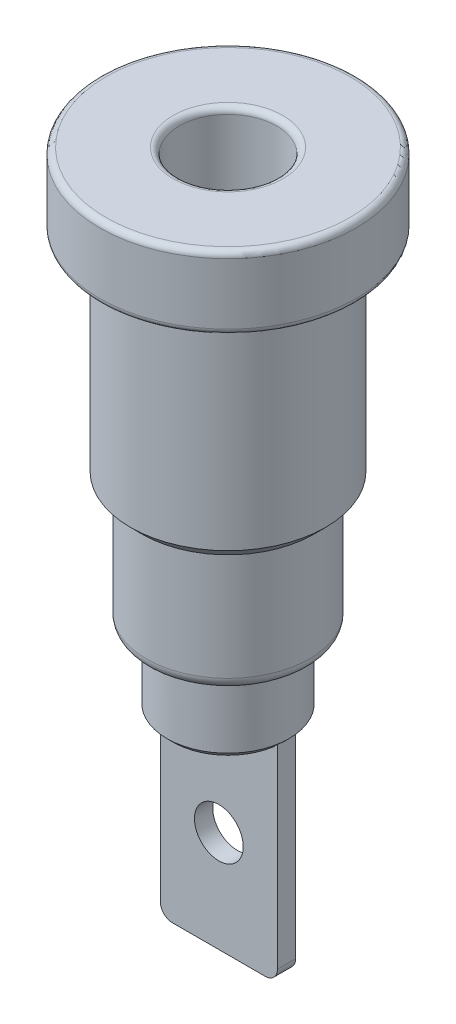
ISO-10303-21;
HEADER;
FILE_DESCRIPTION(('STEP AP214'),'2;1');
FILE_NAME('part.step','',(''),(''),'','','');
FILE_SCHEMA(('AUTOMOTIVE_DESIGN { 1 0 10303 214 1 1 1 1 }'));
ENDSEC;
DATA;
#1=APPLICATION_CONTEXT('core data for automotive mechanical design processes');
#2=APPLICATION_PROTOCOL_DEFINITION('international standard','automotive_design',2000,#1);
#3=PRODUCT_CONTEXT('',#1,'mechanical');
#4=PRODUCT('Part','Part','',(#3));
#5=PRODUCT_RELATED_PRODUCT_CATEGORY('part','',(#4));
#6=PRODUCT_DEFINITION_FORMATION('','',#4);
#7=PRODUCT_DEFINITION_CONTEXT('part definition',#1,'design');
#8=PRODUCT_DEFINITION('design','',#6,#7);
#9=PRODUCT_DEFINITION_SHAPE('','',#8);
#10=(LENGTH_UNIT() NAMED_UNIT(*) SI_UNIT(.MILLI.,.METRE.));
#11=(NAMED_UNIT(*) PLANE_ANGLE_UNIT() SI_UNIT($,.RADIAN.));
#12=(NAMED_UNIT(*) SI_UNIT($,.STERADIAN.) SOLID_ANGLE_UNIT());
#13=UNCERTAINTY_MEASURE_WITH_UNIT(LENGTH_MEASURE(1.E-05),#10,'distance_accuracy_value','');
#14=(GEOMETRIC_REPRESENTATION_CONTEXT(3) GLOBAL_UNCERTAINTY_ASSIGNED_CONTEXT((#13)) GLOBAL_UNIT_ASSIGNED_CONTEXT((#10,
#11,#12)) REPRESENTATION_CONTEXT('',''));
#15=CARTESIAN_POINT('',(0.,0.,0.));
#16=DIRECTION('',(0.,0.,1.));
#17=DIRECTION('',(1.,0.,0.));
#18=AXIS2_PLACEMENT_3D('',#15,#16,#17);
#19=CARTESIAN_POINT('',(-2.5,-20.,0.));
#20=DIRECTION('',(0.,-1.,0.));
#21=DIRECTION('',(1.,0.,0.));
#22=AXIS2_PLACEMENT_3D('',#19,#20,#21);
#23=PLANE('',#22);
#24=DIRECTION('',(-1.,0.,0.));
#25=VECTOR('',#24,1.);
#26=CARTESIAN_POINT('',(2.4,-20.,0.375));
#27=LINE('',#26,#25);
#28=CARTESIAN_POINT('',(2.21852991866235,-20.,0.375));
#29=VERTEX_POINT('',#28);
#30=CARTESIAN_POINT('',(-2.21852991866235,-20.,0.375));
#31=VERTEX_POINT('',#30);
#32=EDGE_CURVE('E123',#29,#31,#27,.T.);
#33=ORIENTED_EDGE('',*,*,#32,.F.);
#34=CARTESIAN_POINT('',(0.,-20.,0.));
#35=DIRECTION('',(0.,-1.,0.));
#36=DIRECTION('',(1.,0.,0.));
#37=AXIS2_PLACEMENT_3D('',#34,#35,#36);
#38=CIRCLE('',#37,2.25);
#39=EDGE_CURVE('E182',#29,#31,#38,.T.);
#40=ORIENTED_EDGE('',*,*,#39,.T.);
#41=EDGE_LOOP('',(#33,#40));
#42=FACE_BOUND('',#41,.T.);
#43=ADVANCED_FACE('F47',(#42),#23,.T.);
#44=DIRECTION('',(-1.,0.,0.));
#45=VECTOR('',#44,1.);
#46=CARTESIAN_POINT('',(2.4,-20.,-0.375));
#47=LINE('',#46,#45);
#48=CARTESIAN_POINT('',(2.21852991866235,-20.,-0.375));
#49=VERTEX_POINT('',#48);
#50=CARTESIAN_POINT('',(-2.21852991866235,-20.,-0.375));
#51=VERTEX_POINT('',#50);
#52=EDGE_CURVE('E146',#49,#51,#47,.T.);
#53=ORIENTED_EDGE('',*,*,#52,.T.);
#54=CARTESIAN_POINT('',(0.,-20.,0.));
#55=DIRECTION('',(0.,-1.,0.));
#56=DIRECTION('',(1.,0.,0.));
#57=AXIS2_PLACEMENT_3D('',#54,#55,#56);
#58=CIRCLE('',#57,2.25);
#59=EDGE_CURVE('E180',#51,#49,#58,.T.);
#60=ORIENTED_EDGE('',*,*,#59,.T.);
#61=EDGE_LOOP('',(#53,#60));
#62=FACE_BOUND('',#61,.T.);
#63=ADVANCED_FACE('F274',(#62),#23,.T.);
#64=CARTESIAN_POINT('',(0.,-20.,0.));
#65=DIRECTION('',(0.,1.,0.));
#66=DIRECTION('',(-1.,0.,0.));
#67=AXIS2_PLACEMENT_3D('',#64,#65,#66);
#68=CYLINDRICAL_SURFACE('',#67,2.);
#69=CARTESIAN_POINT('',(0.,-7.75,0.));
#70=DIRECTION('',(0.,1.,0.));
#71=DIRECTION('',(-1.,0.,0.));
#72=AXIS2_PLACEMENT_3D('',#69,#70,#71);
#73=CIRCLE('',#72,2.);
#74=CARTESIAN_POINT('',(-2.,-7.75,0.));
#75=VERTEX_POINT('',#74);
#76=EDGE_CURVE('E240',#75,#75,#73,.F.);
#77=ORIENTED_EDGE('',*,*,#76,.T.);
#78=EDGE_LOOP('',(#77));
#79=FACE_BOUND('',#78,.T.);
#80=CARTESIAN_POINT('',(0.,-0.25,0.));
#81=DIRECTION('',(0.,1.,0.));
#82=DIRECTION('',(-1.,0.,0.));
#83=AXIS2_PLACEMENT_3D('',#80,#81,#82);
#84=CIRCLE('',#83,2.);
#85=CARTESIAN_POINT('',(-2.,-0.25,0.));
#86=VERTEX_POINT('',#85);
#87=EDGE_CURVE('E237',#86,#86,#84,.T.);
#88=ORIENTED_EDGE('',*,*,#87,.T.);
#89=EDGE_LOOP('',(#88));
#90=FACE_BOUND('',#89,.T.);
#91=ADVANCED_FACE('F265',(#79,#90),#68,.F.);
#92=CARTESIAN_POINT('',(-2.,0.,0.));
#93=DIRECTION('',(0.,1.,0.));
#94=DIRECTION('',(-1.,0.,0.));
#95=AXIS2_PLACEMENT_3D('',#92,#93,#94);
#96=PLANE('',#95);
#97=CARTESIAN_POINT('',(0.,0.,0.));
#98=DIRECTION('',(0.,1.,0.));
#99=DIRECTION('',(-1.,0.,0.));
#100=AXIS2_PLACEMENT_3D('',#97,#98,#99);
#101=CIRCLE('',#100,2.25);
#102=CARTESIAN_POINT('',(-2.25,0.,0.));
#103=VERTEX_POINT('',#102);
#104=EDGE_CURVE('E246',#103,#103,#101,.F.);
#105=ORIENTED_EDGE('',*,*,#104,.T.);
#106=EDGE_LOOP('',(#105));
#107=FACE_BOUND('',#106,.T.);
#108=CARTESIAN_POINT('',(0.,0.,0.));
#109=DIRECTION('',(0.,1.,0.));
#110=DIRECTION('',(-1.,0.,0.));
#111=AXIS2_PLACEMENT_3D('',#108,#109,#110);
#112=CIRCLE('',#111,5.);
#113=CARTESIAN_POINT('',(-5.,0.,0.));
#114=VERTEX_POINT('',#113);
#115=EDGE_CURVE('E243',#114,#114,#112,.T.);
#116=ORIENTED_EDGE('',*,*,#115,.T.);
#117=EDGE_LOOP('',(#116));
#118=FACE_BOUND('',#117,.T.);
#119=ADVANCED_FACE('F263',(#107,#118),#96,.T.);
#120=CARTESIAN_POINT('',(0.,-20.,0.));
#121=DIRECTION('',(0.,1.,0.));
#122=DIRECTION('',(-1.,0.,0.));
#123=AXIS2_PLACEMENT_3D('',#120,#121,#122);
#124=CYLINDRICAL_SURFACE('',#123,5.25);
#125=CARTESIAN_POINT('',(0.,-0.25,0.));
#126=DIRECTION('',(0.,1.,0.));
#127=DIRECTION('',(-1.,0.,0.));
#128=AXIS2_PLACEMENT_3D('',#125,#126,#127);
#129=CIRCLE('',#128,5.25);
#130=CARTESIAN_POINT('',(-5.25,-0.250000000000001,0.));
#131=VERTEX_POINT('',#130);
#132=EDGE_CURVE('E55',#131,#131,#129,.F.);
#133=ORIENTED_EDGE('',*,*,#132,.T.);
#134=EDGE_LOOP('',(#133));
#135=FACE_BOUND('',#134,.T.);
#136=CARTESIAN_POINT('',(0.,-2.75,0.));
#137=DIRECTION('',(0.,-1.,0.));
#138=DIRECTION('',(1.,0.,0.));
#139=AXIS2_PLACEMENT_3D('',#136,#137,#138);
#140=CIRCLE('',#139,5.25);
#141=CARTESIAN_POINT('',(5.25,-2.75,0.));
#142=VERTEX_POINT('',#141);
#143=EDGE_CURVE('E249',#142,#142,#140,.F.);
#144=ORIENTED_EDGE('',*,*,#143,.T.);
#145=EDGE_LOOP('',(#144));
#146=FACE_BOUND('',#145,.T.);
#147=ADVANCED_FACE('F254',(#135,#146),#124,.T.);
#148=CARTESIAN_POINT('',(-5.25,-3.,0.));
#149=DIRECTION('',(0.,-1.,0.));
#150=DIRECTION('',(1.,0.,0.));
#151=AXIS2_PLACEMENT_3D('',#148,#149,#150);
#152=PLANE('',#151);
#153=CARTESIAN_POINT('',(0.,-3.,0.));
#154=DIRECTION('',(0.,-1.,0.));
#155=DIRECTION('',(1.,0.,0.));
#156=AXIS2_PLACEMENT_3D('',#153,#154,#155);
#157=CIRCLE('',#156,5.);
#158=CARTESIAN_POINT('',(4.99999999999999,-3.,0.));
#159=VERTEX_POINT('',#158);
#160=EDGE_CURVE('E11',#159,#159,#157,.T.);
#161=ORIENTED_EDGE('',*,*,#160,.T.);
#162=EDGE_LOOP('',(#161));
#163=FACE_BOUND('',#162,.T.);
#164=CARTESIAN_POINT('',(0.,-3.,0.));
#165=DIRECTION('',(0.,1.,0.));
#166=DIRECTION('',(-1.,0.,0.));
#167=AXIS2_PLACEMENT_3D('',#164,#165,#166);
#168=CIRCLE('',#167,4.);
#169=CARTESIAN_POINT('',(-4.,-3.,0.));
#170=VERTEX_POINT('',#169);
#171=EDGE_CURVE('E174',#170,#170,#168,.T.);
#172=ORIENTED_EDGE('',*,*,#171,.T.);
#173=EDGE_LOOP('',(#172));
#174=FACE_BOUND('',#173,.T.);
#175=ADVANCED_FACE('F272',(#163,#174),#152,.T.);
#176=CARTESIAN_POINT('',(0.,-20.,0.));
#177=DIRECTION('',(0.,1.,0.));
#178=DIRECTION('',(-1.,0.,0.));
#179=AXIS2_PLACEMENT_3D('',#176,#177,#178);
#180=CYLINDRICAL_SURFACE('',#179,4.);
#181=CARTESIAN_POINT('',(0.,-11.5,0.));
#182=DIRECTION('',(0.,-1.,0.));
#183=DIRECTION('',(1.,0.,0.));
#184=AXIS2_PLACEMENT_3D('',#181,#182,#183);
#185=CIRCLE('',#184,4.);
#186=CARTESIAN_POINT('',(4.,-11.5,0.));
#187=VERTEX_POINT('',#186);
#188=EDGE_CURVE('E222',#187,#187,#185,.F.);
#189=ORIENTED_EDGE('',*,*,#188,.T.);
#190=EDGE_LOOP('',(#189));
#191=FACE_BOUND('',#190,.T.);
#192=ORIENTED_EDGE('',*,*,#171,.F.);
#193=EDGE_LOOP('',(#192));
#194=FACE_BOUND('',#193,.T.);
#195=ADVANCED_FACE('F305',(#191,#194),#180,.T.);
#196=CARTESIAN_POINT('',(-4.,-12.,0.));
#197=DIRECTION('',(0.,-1.,0.));
#198=DIRECTION('',(1.,0.,0.));
#199=AXIS2_PLACEMENT_3D('',#196,#197,#198);
#200=PLANE('',#199);
#201=CARTESIAN_POINT('',(0.,-12.,0.));
#202=DIRECTION('',(0.,-1.,0.));
#203=DIRECTION('',(1.,0.,0.));
#204=AXIS2_PLACEMENT_3D('',#201,#202,#203);
#205=CIRCLE('',#204,3.5);
#206=CARTESIAN_POINT('',(3.5,-12.,0.));
#207=VERTEX_POINT('',#206);
#208=EDGE_CURVE('E231',#207,#207,#205,.T.);
#209=ORIENTED_EDGE('',*,*,#208,.T.);
#210=EDGE_LOOP('',(#209));
#211=FACE_BOUND('',#210,.T.);
#212=CARTESIAN_POINT('',(0.,-12.,0.));
#213=DIRECTION('',(0.,1.,0.));
#214=DIRECTION('',(-1.,0.,0.));
#215=AXIS2_PLACEMENT_3D('',#212,#213,#214);
#216=CIRCLE('',#215,3.34);
#217=CARTESIAN_POINT('',(-3.34,-12.,0.));
#218=VERTEX_POINT('',#217);
#219=EDGE_CURVE('E171',#218,#218,#216,.T.);
#220=ORIENTED_EDGE('',*,*,#219,.T.);
#221=EDGE_LOOP('',(#220));
#222=FACE_BOUND('',#221,.T.);
#223=ADVANCED_FACE('F301',(#211,#222),#200,.T.);
#224=CARTESIAN_POINT('',(0.,-20.,0.));
#225=DIRECTION('',(0.,1.,0.));
#226=DIRECTION('',(-1.,0.,0.));
#227=AXIS2_PLACEMENT_3D('',#224,#225,#226);
#228=CYLINDRICAL_SURFACE('',#227,3.34);
#229=CARTESIAN_POINT('',(0.,-16.5,0.));
#230=DIRECTION('',(0.,1.,0.));
#231=DIRECTION('',(-1.,0.,0.));
#232=AXIS2_PLACEMENT_3D('',#229,#230,#231);
#233=CIRCLE('',#232,3.34);
#234=CARTESIAN_POINT('',(-3.34,-16.5,0.));
#235=VERTEX_POINT('',#234);
#236=EDGE_CURVE('E168',#235,#235,#233,.T.);
#237=ORIENTED_EDGE('',*,*,#236,.T.);
#238=EDGE_LOOP('',(#237));
#239=FACE_BOUND('',#238,.T.);
#240=ORIENTED_EDGE('',*,*,#219,.F.);
#241=EDGE_LOOP('',(#240));
#242=FACE_BOUND('',#241,.T.);
#243=ADVANCED_FACE('F297',(#239,#242),#228,.T.);
#244=CARTESIAN_POINT('',(0.,-16.5,0.));
#245=DIRECTION('',(0.,1.,0.));
#246=DIRECTION('',(-1.,0.,0.));
#247=AXIS2_PLACEMENT_3D('',#244,#245,#246);
#248=TOROIDAL_SURFACE('',#247,2.84,0.5);
#249=CARTESIAN_POINT('',(0.,-17.,0.));
#250=DIRECTION('',(0.,1.,0.));
#251=DIRECTION('',(-1.,0.,0.));
#252=AXIS2_PLACEMENT_3D('',#249,#250,#251);
#253=CIRCLE('',#252,2.84);
#254=CARTESIAN_POINT('',(-2.84,-17.,0.));
#255=VERTEX_POINT('',#254);
#256=EDGE_CURVE('E165',#255,#255,#253,.T.);
#257=ORIENTED_EDGE('',*,*,#256,.T.);
#258=EDGE_LOOP('',(#257));
#259=FACE_BOUND('',#258,.T.);
#260=ORIENTED_EDGE('',*,*,#236,.F.);
#261=EDGE_LOOP('',(#260));
#262=FACE_BOUND('',#261,.T.);
#263=ADVANCED_FACE('F293',(#259,#262),#248,.T.);
#264=CARTESIAN_POINT('',(-2.84,-17.,0.));
#265=DIRECTION('',(0.,-1.,0.));
#266=DIRECTION('',(1.,0.,0.));
#267=AXIS2_PLACEMENT_3D('',#264,#265,#266);
#268=PLANE('',#267);
#269=CARTESIAN_POINT('',(0.,-17.,0.));
#270=DIRECTION('',(0.,1.,0.));
#271=DIRECTION('',(-1.,0.,0.));
#272=AXIS2_PLACEMENT_3D('',#269,#270,#271);
#273=CIRCLE('',#272,2.5);
#274=CARTESIAN_POINT('',(-2.5,-17.,0.));
#275=VERTEX_POINT('',#274);
#276=EDGE_CURVE('E131',#275,#275,#273,.T.);
#277=ORIENTED_EDGE('',*,*,#276,.T.);
#278=EDGE_LOOP('',(#277));
#279=FACE_BOUND('',#278,.T.);
#280=ORIENTED_EDGE('',*,*,#256,.F.);
#281=EDGE_LOOP('',(#280));
#282=FACE_BOUND('',#281,.T.);
#283=ADVANCED_FACE('F289',(#279,#282),#268,.T.);
#284=CARTESIAN_POINT('',(0.,-20.,0.));
#285=DIRECTION('',(0.,1.,0.));
#286=DIRECTION('',(-1.,0.,0.));
#287=AXIS2_PLACEMENT_3D('',#284,#285,#286);
#288=CYLINDRICAL_SURFACE('',#287,2.5);
#289=CARTESIAN_POINT('',(0.,-19.75,0.));
#290=DIRECTION('',(0.,-1.,0.));
#291=DIRECTION('',(1.,0.,0.));
#292=AXIS2_PLACEMENT_3D('',#289,#290,#291);
#293=CIRCLE('',#292,2.5);
#294=CARTESIAN_POINT('',(2.5,-19.75,0.));
#295=VERTEX_POINT('',#294);
#296=EDGE_CURVE('E177',#295,#295,#293,.F.);
#297=ORIENTED_EDGE('',*,*,#296,.T.);
#298=EDGE_LOOP('',(#297));
#299=FACE_BOUND('',#298,.T.);
#300=ORIENTED_EDGE('',*,*,#276,.F.);
#301=EDGE_LOOP('',(#300));
#302=FACE_BOUND('',#301,.T.);
#303=ADVANCED_FACE('F286',(#299,#302),#288,.T.);
#304=CARTESIAN_POINT('',(0.,-8.,0.));
#305=DIRECTION('',(0.,1.,0.));
#306=DIRECTION('',(-1.,0.,0.));
#307=AXIS2_PLACEMENT_3D('',#304,#305,#306);
#308=PLANE('',#307);
#309=CARTESIAN_POINT('',(0.,-8.,0.));
#310=DIRECTION('',(0.,1.,0.));
#311=DIRECTION('',(-1.,0.,0.));
#312=AXIS2_PLACEMENT_3D('',#309,#310,#311);
#313=CIRCLE('',#312,1.75);
#314=CARTESIAN_POINT('',(-1.75,-8.,0.));
#315=VERTEX_POINT('',#314);
#316=EDGE_CURVE('E234',#315,#315,#313,.T.);
#317=ORIENTED_EDGE('',*,*,#316,.T.);
#318=EDGE_LOOP('',(#317));
#319=FACE_BOUND('',#318,.T.);
#320=ADVANCED_FACE('F209',(#319),#308,.T.);
#321=CARTESIAN_POINT('',(-1.9,-27.8,0.375));
#322=DIRECTION('',(0.,0.,1.));
#323=DIRECTION('',(1.,0.,0.));
#324=AXIS2_PLACEMENT_3D('',#321,#322,#323);
#325=PLANE('',#324);
#326=DIRECTION('',(0.,1.,0.));
#327=VECTOR('',#326,1.);
#328=CARTESIAN_POINT('',(2.4,-27.8,0.375));
#329=LINE('',#328,#327);
#330=CARTESIAN_POINT('',(2.4,-27.8,0.375));
#331=VERTEX_POINT('',#330);
#332=CARTESIAN_POINT('',(2.4,-19.8208797888948,0.375));
#333=VERTEX_POINT('',#332);
#334=EDGE_CURVE('E62',#331,#333,#329,.T.);
#335=ORIENTED_EDGE('',*,*,#334,.T.);
#336=CARTESIAN_POINT('',(2.4,-19.8208797888948,0.375));
#337=CARTESIAN_POINT('',(2.36977007604474,-19.8507484448252,0.375));
#338=CARTESIAN_POINT('',(2.33953260732597,-19.8806094570127,0.375));
#339=CARTESIAN_POINT('',(2.27904258021349,-19.9403161940479,0.375));
#340=CARTESIAN_POINT('',(2.24879002181972,-19.9701619188954,0.375));
#341=CARTESIAN_POINT('',(2.21852991866235,-20.,0.375));
#342=B_SPLINE_CURVE_WITH_KNOTS('',3,(#336,#337,#338,#339,#340,#341),.UNSPECIFIED.,.F.,.F.,(4,2,
4),(0.,0.127490631304574,0.254981263232596),.UNSPECIFIED.);
#343=EDGE_CURVE('E215',#333,#29,#342,.T.);
#344=ORIENTED_EDGE('',*,*,#343,.T.);
#345=ORIENTED_EDGE('',*,*,#32,.T.);
#346=CARTESIAN_POINT('',(-2.21852991866235,-20.,0.375));
#347=CARTESIAN_POINT('',(-2.24879002181972,-19.9701619188954,0.375));
#348=CARTESIAN_POINT('',(-2.27904258021349,-19.9403161940479,0.375));
#349=CARTESIAN_POINT('',(-2.33953260732596,-19.8806094570127,0.375));
#350=CARTESIAN_POINT('',(-2.36977007604474,-19.8507484448252,0.375));
#351=CARTESIAN_POINT('',(-2.4,-19.8208797888948,0.375));
#352=B_SPLINE_CURVE_WITH_KNOTS('',3,(#346,#347,#348,#349,#350,#351),.UNSPECIFIED.,.F.,.F.,(4,2,
4),(0.,0.127490631928022,0.254981263232595),.UNSPECIFIED.);
#353=CARTESIAN_POINT('',(-2.4,-19.8208797888948,0.375));
#354=VERTEX_POINT('',#353);
#355=EDGE_CURVE('E119',#31,#354,#352,.T.);
#356=ORIENTED_EDGE('',*,*,#355,.T.);
#357=DIRECTION('',(0.,-1.,0.));
#358=VECTOR('',#357,1.);
#359=CARTESIAN_POINT('',(-2.4,-20.,0.375));
#360=LINE('',#359,#358);
#361=CARTESIAN_POINT('',(-2.4,-27.8,0.375));
#362=VERTEX_POINT('',#361);
#363=EDGE_CURVE('E111',#354,#362,#360,.T.);
#364=ORIENTED_EDGE('',*,*,#363,.T.);
#365=CARTESIAN_POINT('',(-1.9,-27.8,0.375));
#366=DIRECTION('',(0.,0.,1.));
#367=DIRECTION('',(1.,0.,0.));
#368=AXIS2_PLACEMENT_3D('',#365,#366,#367);
#369=CIRCLE('',#368,0.499999999999999);
#370=CARTESIAN_POINT('',(-1.9,-28.3,0.375));
#371=VERTEX_POINT('',#370);
#372=EDGE_CURVE('E116',#362,#371,#369,.T.);
#373=ORIENTED_EDGE('',*,*,#372,.T.);
#374=DIRECTION('',(1.,0.,0.));
#375=VECTOR('',#374,1.);
#376=CARTESIAN_POINT('',(-1.9,-28.3,0.375));
#377=LINE('',#376,#375);
#378=CARTESIAN_POINT('',(1.9,-28.3,0.375));
#379=VERTEX_POINT('',#378);
#380=EDGE_CURVE('E137',#371,#379,#377,.T.);
#381=ORIENTED_EDGE('',*,*,#380,.T.);
#382=CARTESIAN_POINT('',(1.9,-27.8,0.375));
#383=DIRECTION('',(0.,0.,1.));
#384=DIRECTION('',(1.,0.,0.));
#385=AXIS2_PLACEMENT_3D('',#382,#383,#384);
#386=CIRCLE('',#385,0.499999999999998);
#387=EDGE_CURVE('E139',#379,#331,#386,.T.);
#388=ORIENTED_EDGE('',*,*,#387,.T.);
#389=EDGE_LOOP('',(#335,#344,#345,#356,#364,#373,#381,#388));
#390=FACE_BOUND('',#389,.T.);
#391=CARTESIAN_POINT('',(0.,-24.15,0.375));
#392=DIRECTION('',(0.,0.,1.));
#393=DIRECTION('',(1.,0.,0.));
#394=AXIS2_PLACEMENT_3D('',#391,#392,#393);
#395=CIRCLE('',#394,1.);
#396=CARTESIAN_POINT('',(1.,-24.15,0.375));
#397=VERTEX_POINT('',#396);
#398=EDGE_CURVE('E149',#397,#397,#395,.T.);
#399=ORIENTED_EDGE('',*,*,#398,.F.);
#400=EDGE_LOOP('',(#399));
#401=FACE_BOUND('',#400,.T.);
#402=ADVANCED_FACE('F113',(#390,#401),#325,.T.);
#403=CARTESIAN_POINT('',(-1.9,-27.8,-0.375));
#404=DIRECTION('',(0.,0.,1.));
#405=DIRECTION('',(1.,0.,0.));
#406=AXIS2_PLACEMENT_3D('',#403,#404,#405);
#407=PLANE('',#406);
#408=ORIENTED_EDGE('',*,*,#52,.F.);
#409=CARTESIAN_POINT('',(2.21852991866235,-20.,-0.375));
#410=CARTESIAN_POINT('',(2.24879002181971,-19.9701619188954,-0.375));
#411=CARTESIAN_POINT('',(2.27904258021349,-19.9403161940479,-0.375));
#412=CARTESIAN_POINT('',(2.33953260732596,-19.8806094570127,-0.375));
#413=CARTESIAN_POINT('',(2.36977007604474,-19.8507484448252,-0.375));
#414=CARTESIAN_POINT('',(2.4,-19.8208797888948,-0.375));
#415=B_SPLINE_CURVE_WITH_KNOTS('',3,(#409,#410,#411,#412,#413,#414),.UNSPECIFIED.,.F.,.F.,(4,2,
4),(0.,0.127490631928022,0.254981263232594),.UNSPECIFIED.);
#416=CARTESIAN_POINT('',(2.4,-19.8208797888948,-0.375));
#417=VERTEX_POINT('',#416);
#418=EDGE_CURVE('E617',#49,#417,#415,.T.);
#419=ORIENTED_EDGE('',*,*,#418,.T.);
#420=DIRECTION('',(0.,1.,0.));
#421=VECTOR('',#420,1.);
#422=CARTESIAN_POINT('',(2.4,-27.8,-0.375));
#423=LINE('',#422,#421);
#424=CARTESIAN_POINT('',(2.4,-27.8,-0.375));
#425=VERTEX_POINT('',#424);
#426=EDGE_CURVE('E69',#425,#417,#423,.T.);
#427=ORIENTED_EDGE('',*,*,#426,.F.);
#428=CARTESIAN_POINT('',(1.9,-27.8,-0.375));
#429=DIRECTION('',(0.,0.,1.));
#430=DIRECTION('',(1.,0.,0.));
#431=AXIS2_PLACEMENT_3D('',#428,#429,#430);
#432=CIRCLE('',#431,0.499999999999998);
#433=CARTESIAN_POINT('',(1.9,-28.3,-0.375));
#434=VERTEX_POINT('',#433);
#435=EDGE_CURVE('E155',#434,#425,#432,.T.);
#436=ORIENTED_EDGE('',*,*,#435,.F.);
#437=DIRECTION('',(1.,0.,0.));
#438=VECTOR('',#437,1.);
#439=CARTESIAN_POINT('',(-1.9,-28.3,-0.375));
#440=LINE('',#439,#438);
#441=CARTESIAN_POINT('',(-1.9,-28.3,-0.375));
#442=VERTEX_POINT('',#441);
#443=EDGE_CURVE('E153',#442,#434,#440,.T.);
#444=ORIENTED_EDGE('',*,*,#443,.F.);
#445=CARTESIAN_POINT('',(-1.9,-27.8,-0.375));
#446=DIRECTION('',(0.,0.,1.));
#447=DIRECTION('',(1.,0.,0.));
#448=AXIS2_PLACEMENT_3D('',#445,#446,#447);
#449=CIRCLE('',#448,0.499999999999999);
#450=CARTESIAN_POINT('',(-2.4,-27.8,-0.375));
#451=VERTEX_POINT('',#450);
#452=EDGE_CURVE('E151',#451,#442,#449,.T.);
#453=ORIENTED_EDGE('',*,*,#452,.F.);
#454=DIRECTION('',(0.,-1.,0.));
#455=VECTOR('',#454,1.);
#456=CARTESIAN_POINT('',(-2.4,-20.,-0.375));
#457=LINE('',#456,#455);
#458=CARTESIAN_POINT('',(-2.4,-19.8208797888948,-0.375));
#459=VERTEX_POINT('',#458);
#460=EDGE_CURVE('E128',#459,#451,#457,.T.);
#461=ORIENTED_EDGE('',*,*,#460,.F.);
#462=CARTESIAN_POINT('',(-2.4,-19.8208797888948,-0.375));
#463=CARTESIAN_POINT('',(-2.36977007604474,-19.8507484448252,-0.375));
#464=CARTESIAN_POINT('',(-2.33953260732597,-19.8806094570127,-0.375));
#465=CARTESIAN_POINT('',(-2.27904258021349,-19.9403161940479,-0.375));
#466=CARTESIAN_POINT('',(-2.24879002181972,-19.9701619188954,-0.375));
#467=CARTESIAN_POINT('',(-2.21852991866235,-20.,-0.375));
#468=B_SPLINE_CURVE_WITH_KNOTS('',3,(#462,#463,#464,#465,#466,#467),.UNSPECIFIED.,.F.,.F.,(4,2,
4),(0.,0.127490631304573,0.254981263232595),.UNSPECIFIED.);
#469=EDGE_CURVE('E618',#459,#51,#468,.T.);
#470=ORIENTED_EDGE('',*,*,#469,.T.);
#471=EDGE_LOOP('',(#408,#419,#427,#436,#444,#453,#461,#470));
#472=FACE_BOUND('',#471,.T.);
#473=CARTESIAN_POINT('',(0.,-24.15,-0.375));
#474=DIRECTION('',(0.,0.,1.));
#475=DIRECTION('',(1.,0.,0.));
#476=AXIS2_PLACEMENT_3D('',#473,#474,#475);
#477=CIRCLE('',#476,1.);
#478=CARTESIAN_POINT('',(1.,-24.15,-0.375));
#479=VERTEX_POINT('',#478);
#480=EDGE_CURVE('E606',#479,#479,#477,.T.);
#481=ORIENTED_EDGE('',*,*,#480,.T.);
#482=EDGE_LOOP('',(#481));
#483=FACE_BOUND('',#482,.T.);
#484=ADVANCED_FACE('F208',(#472,#483),#407,.F.);
#485=CARTESIAN_POINT('',(-2.4,-20.,0.375));
#486=DIRECTION('',(1.,0.,0.));
#487=DIRECTION('',(0.,0.,-1.));
#488=AXIS2_PLACEMENT_3D('',#485,#486,#487);
#489=PLANE('',#488);
#490=ORIENTED_EDGE('',*,*,#460,.T.);
#491=DIRECTION('',(0.,0.,-1.));
#492=VECTOR('',#491,1.);
#493=CARTESIAN_POINT('',(-2.4,-27.8,0.375));
#494=LINE('',#493,#492);
#495=EDGE_CURVE('E126',#362,#451,#494,.T.);
#496=ORIENTED_EDGE('',*,*,#495,.F.);
#497=ORIENTED_EDGE('',*,*,#363,.F.);
#498=CARTESIAN_POINT('',(-2.4,-19.8208797888948,0.375));
#499=CARTESIAN_POINT('',(-2.4,-19.8305131858353,0.312811445684797));
#500=CARTESIAN_POINT('',(-2.4,-19.837808047552,0.250247909449109));
#501=CARTESIAN_POINT('',(-2.4,-19.8475370817473,0.125121432606498));
#502=CARTESIAN_POINT('',(-2.4,-19.85,0.0625607163032488));
#503=CARTESIAN_POINT('',(-2.4,-19.85,-0.0625607163032494));
#504=CARTESIAN_POINT('',(-2.4,-19.8475370817473,-0.125121432606499));
#505=CARTESIAN_POINT('',(-2.4,-19.837808047552,-0.25024790944911));
#506=CARTESIAN_POINT('',(-2.4,-19.8305131858353,-0.312811445684798));
#507=CARTESIAN_POINT('',(-2.4,-19.8208797888948,-0.375000000000001));
#508=B_SPLINE_CURVE_WITH_KNOTS('',3,(#498,#499,#500,#501,#502,#503,#504,#505,#506,#507),
.UNSPECIFIED.,.F.,.F.,(4,2,2,2,4),(0.,0.18876643913239,0.376406438706506,0.564046438280622,
0.752812877413012),.UNSPECIFIED.);
#509=EDGE_CURVE('E192',#354,#459,#508,.T.);
#510=ORIENTED_EDGE('',*,*,#509,.T.);
#511=EDGE_LOOP('',(#490,#496,#497,#510));
#512=FACE_BOUND('',#511,.T.);
#513=ADVANCED_FACE('F127',(#512),#489,.F.);
#514=CARTESIAN_POINT('',(-1.9,-27.8,0.375));
#515=DIRECTION('',(0.,0.,-1.));
#516=DIRECTION('',(-1.,0.,0.));
#517=AXIS2_PLACEMENT_3D('',#514,#515,#516);
#518=CYLINDRICAL_SURFACE('',#517,0.499999999999999);
#519=ORIENTED_EDGE('',*,*,#452,.T.);
#520=DIRECTION('',(0.,0.,-1.));
#521=VECTOR('',#520,1.);
#522=CARTESIAN_POINT('',(-1.9,-28.3,0.375));
#523=LINE('',#522,#521);
#524=EDGE_CURVE('E132',#371,#442,#523,.T.);
#525=ORIENTED_EDGE('',*,*,#524,.F.);
#526=ORIENTED_EDGE('',*,*,#372,.F.);
#527=ORIENTED_EDGE('',*,*,#495,.T.);
#528=EDGE_LOOP('',(#519,#525,#526,#527));
#529=FACE_BOUND('',#528,.T.);
#530=ADVANCED_FACE('F134',(#529),#518,.T.);
#531=CARTESIAN_POINT('',(-1.9,-28.3,0.375));
#532=DIRECTION('',(0.,1.,0.));
#533=DIRECTION('',(0.,0.,1.));
#534=AXIS2_PLACEMENT_3D('',#531,#532,#533);
#535=PLANE('',#534);
#536=ORIENTED_EDGE('',*,*,#443,.T.);
#537=DIRECTION('',(0.,0.,-1.));
#538=VECTOR('',#537,1.);
#539=CARTESIAN_POINT('',(1.9,-28.3,0.375));
#540=LINE('',#539,#538);
#541=EDGE_CURVE('E159',#379,#434,#540,.T.);
#542=ORIENTED_EDGE('',*,*,#541,.F.);
#543=ORIENTED_EDGE('',*,*,#380,.F.);
#544=ORIENTED_EDGE('',*,*,#524,.T.);
#545=EDGE_LOOP('',(#536,#542,#543,#544));
#546=FACE_BOUND('',#545,.T.);
#547=ADVANCED_FACE('F406',(#546),#535,.F.);
#548=CARTESIAN_POINT('',(1.9,-27.8,0.375));
#549=DIRECTION('',(0.,0.,-1.));
#550=DIRECTION('',(-1.,0.,0.));
#551=AXIS2_PLACEMENT_3D('',#548,#549,#550);
#552=CYLINDRICAL_SURFACE('',#551,0.499999999999998);
#553=ORIENTED_EDGE('',*,*,#435,.T.);
#554=DIRECTION('',(0.,0.,-1.));
#555=VECTOR('',#554,1.);
#556=CARTESIAN_POINT('',(2.4,-27.8,0.375));
#557=LINE('',#556,#555);
#558=EDGE_CURVE('E145',#331,#425,#557,.T.);
#559=ORIENTED_EDGE('',*,*,#558,.F.);
#560=ORIENTED_EDGE('',*,*,#387,.F.);
#561=ORIENTED_EDGE('',*,*,#541,.T.);
#562=EDGE_LOOP('',(#553,#559,#560,#561));
#563=FACE_BOUND('',#562,.T.);
#564=ADVANCED_FACE('F417',(#563),#552,.T.);
#565=CARTESIAN_POINT('',(2.4,-27.8,0.375));
#566=DIRECTION('',(-1.,0.,0.));
#567=DIRECTION('',(0.,-1.,0.));
#568=AXIS2_PLACEMENT_3D('',#565,#566,#567);
#569=PLANE('',#568);
#570=ORIENTED_EDGE('',*,*,#426,.T.);
#571=CARTESIAN_POINT('',(2.4,-19.8208797888948,-0.375));
#572=CARTESIAN_POINT('',(2.4,-19.8305131858353,-0.312811445684797));
#573=CARTESIAN_POINT('',(2.4,-19.837808047552,-0.250247909449109));
#574=CARTESIAN_POINT('',(2.4,-19.8475370817473,-0.125121432606498));
#575=CARTESIAN_POINT('',(2.4,-19.85,-0.062560716303249));
#576=CARTESIAN_POINT('',(2.4,-19.85,0.0625607163032492));
#577=CARTESIAN_POINT('',(2.4,-19.8475370817473,0.125121432606498));
#578=CARTESIAN_POINT('',(2.4,-19.837808047552,0.250247909449109));
#579=CARTESIAN_POINT('',(2.4,-19.8305131858353,0.312811445684797));
#580=CARTESIAN_POINT('',(2.4,-19.8208797888948,0.375));
#581=B_SPLINE_CURVE_WITH_KNOTS('',3,(#571,#572,#573,#574,#575,#576,#577,#578,#579,#580),
.UNSPECIFIED.,.F.,.F.,(4,2,2,2,4),(0.,0.188766439132389,0.376406438706506,0.564046438280622,
0.752812877413011),.UNSPECIFIED.);
#582=EDGE_CURVE('E223',#417,#333,#581,.T.);
#583=ORIENTED_EDGE('',*,*,#582,.T.);
#584=ORIENTED_EDGE('',*,*,#334,.F.);
#585=ORIENTED_EDGE('',*,*,#558,.T.);
#586=EDGE_LOOP('',(#570,#583,#584,#585));
#587=FACE_BOUND('',#586,.T.);
#588=ADVANCED_FACE('F429',(#587),#569,.F.);
#589=CARTESIAN_POINT('',(0.,-24.15,0.375));
#590=DIRECTION('',(0.,0.,-1.));
#591=DIRECTION('',(-1.,0.,0.));
#592=AXIS2_PLACEMENT_3D('',#589,#590,#591);
#593=CYLINDRICAL_SURFACE('',#592,1.);
#594=ORIENTED_EDGE('',*,*,#398,.T.);
#595=EDGE_LOOP('',(#594));
#596=FACE_BOUND('',#595,.T.);
#597=ORIENTED_EDGE('',*,*,#480,.F.);
#598=EDGE_LOOP('',(#597));
#599=FACE_BOUND('',#598,.T.);
#600=ADVANCED_FACE('F210',(#596,#599),#593,.F.);
#601=CARTESIAN_POINT('',(0.,-19.75,0.));
#602=DIRECTION('',(0.,1.,0.));
#603=DIRECTION('',(-1.,0.,0.));
#604=AXIS2_PLACEMENT_3D('',#601,#602,#603);
#605=CONICAL_SURFACE('',#604,2.5,0.785398163397445);
#606=ORIENTED_EDGE('',*,*,#355,.F.);
#607=ORIENTED_EDGE('',*,*,#39,.F.);
#608=ORIENTED_EDGE('',*,*,#343,.F.);
#609=ORIENTED_EDGE('',*,*,#582,.F.);
#610=ORIENTED_EDGE('',*,*,#418,.F.);
#611=ORIENTED_EDGE('',*,*,#59,.F.);
#612=ORIENTED_EDGE('',*,*,#469,.F.);
#613=ORIENTED_EDGE('',*,*,#509,.F.);
#614=EDGE_LOOP('',(#606,#607,#608,#609,#610,#611,#612,#613));
#615=FACE_BOUND('',#614,.T.);
#616=ORIENTED_EDGE('',*,*,#296,.F.);
#617=EDGE_LOOP('',(#616));
#618=FACE_BOUND('',#617,.T.);
#619=ADVANCED_FACE('F200',(#615,#618),#605,.T.);
#620=CARTESIAN_POINT('',(0.,-11.5,0.));
#621=DIRECTION('',(0.,1.,0.));
#622=DIRECTION('',(-1.,0.,0.));
#623=AXIS2_PLACEMENT_3D('',#620,#621,#622);
#624=CONICAL_SURFACE('',#623,4.,0.785398163397451);
#625=ORIENTED_EDGE('',*,*,#208,.F.);
#626=EDGE_LOOP('',(#625));
#627=FACE_BOUND('',#626,.T.);
#628=ORIENTED_EDGE('',*,*,#188,.F.);
#629=EDGE_LOOP('',(#628));
#630=FACE_BOUND('',#629,.T.);
#631=ADVANCED_FACE('F345',(#627,#630),#624,.T.);
#632=CARTESIAN_POINT('',(0.,-7.75,0.));
#633=DIRECTION('',(0.,1.,0.));
#634=DIRECTION('',(-1.,0.,0.));
#635=AXIS2_PLACEMENT_3D('',#632,#633,#634);
#636=TOROIDAL_SURFACE('',#635,1.75,0.25);
#637=ORIENTED_EDGE('',*,*,#76,.F.);
#638=EDGE_LOOP('',(#637));
#639=FACE_BOUND('',#638,.T.);
#640=ORIENTED_EDGE('',*,*,#316,.F.);
#641=EDGE_LOOP('',(#640));
#642=FACE_BOUND('',#641,.T.);
#643=ADVANCED_FACE('F337',(#639,#642),#636,.F.);
#644=CARTESIAN_POINT('',(0.,-0.25,0.));
#645=DIRECTION('',(0.,1.,0.));
#646=DIRECTION('',(-1.,0.,0.));
#647=AXIS2_PLACEMENT_3D('',#644,#645,#646);
#648=TOROIDAL_SURFACE('',#647,2.25,0.25);
#649=ORIENTED_EDGE('',*,*,#104,.F.);
#650=EDGE_LOOP('',(#649));
#651=FACE_BOUND('',#650,.T.);
#652=ORIENTED_EDGE('',*,*,#87,.F.);
#653=EDGE_LOOP('',(#652));
#654=FACE_BOUND('',#653,.T.);
#655=ADVANCED_FACE('F260',(#651,#654),#648,.T.);
#656=CARTESIAN_POINT('',(0.,-0.25,0.));
#657=DIRECTION('',(0.,1.,0.));
#658=DIRECTION('',(-1.,0.,0.));
#659=AXIS2_PLACEMENT_3D('',#656,#657,#658);
#660=TOROIDAL_SURFACE('',#659,5.,0.25);
#661=ORIENTED_EDGE('',*,*,#132,.F.);
#662=EDGE_LOOP('',(#661));
#663=FACE_BOUND('',#662,.T.);
#664=ORIENTED_EDGE('',*,*,#115,.F.);
#665=EDGE_LOOP('',(#664));
#666=FACE_BOUND('',#665,.T.);
#667=ADVANCED_FACE('F257',(#663,#666),#660,.T.);
#668=CARTESIAN_POINT('',(0.,-2.75,0.));
#669=DIRECTION('',(0.,-1.,0.));
#670=DIRECTION('',(1.,0.,0.));
#671=AXIS2_PLACEMENT_3D('',#668,#669,#670);
#672=TOROIDAL_SURFACE('',#671,5.,0.25);
#673=ORIENTED_EDGE('',*,*,#160,.F.);
#674=EDGE_LOOP('',(#673));
#675=FACE_BOUND('',#674,.T.);
#676=ORIENTED_EDGE('',*,*,#143,.F.);
#677=EDGE_LOOP('',(#676));
#678=FACE_BOUND('',#677,.T.);
#679=ADVANCED_FACE('F49',(#675,#678),#672,.T.);
#680=CLOSED_SHELL('',(#43,#63,#91,#119,#147,#175,#195,#223,#243,#263,#283,#303,#320,#402,#484,
#513,#530,#547,#564,#588,#600,#619,#631,#643,#655,#667,#679));
#681=MANIFOLD_SOLID_BREP('B2',#680);
#682=ADVANCED_BREP_SHAPE_REPRESENTATION('',(#18,#681),#14);
#683=SHAPE_DEFINITION_REPRESENTATION(#9,#682);
ENDSEC;
END-ISO-10303-21;
